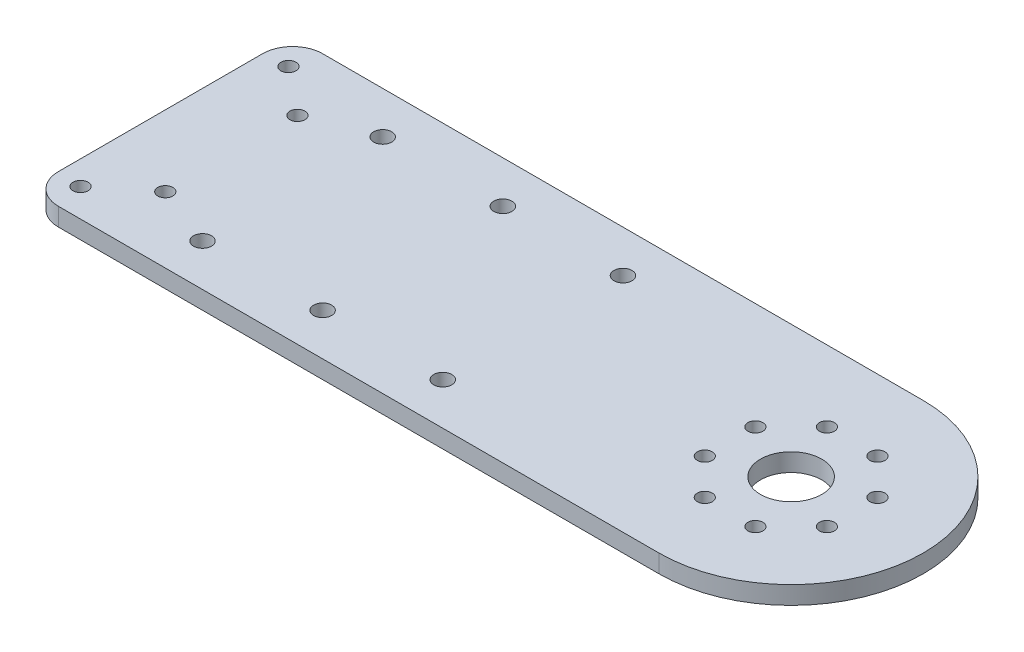
ISO-10303-21;
HEADER;
FILE_DESCRIPTION(('STEP AP214'),'2;1');
FILE_NAME('part.step','',(''),(''),'','','');
FILE_SCHEMA(('AUTOMOTIVE_DESIGN { 1 0 10303 214 1 1 1 1 }'));
ENDSEC;
DATA;
#1=APPLICATION_CONTEXT('core data for automotive mechanical design processes');
#2=APPLICATION_PROTOCOL_DEFINITION('international standard','automotive_design',2000,#1);
#3=PRODUCT_CONTEXT('',#1,'mechanical');
#4=PRODUCT('Part','Part','',(#3));
#5=PRODUCT_RELATED_PRODUCT_CATEGORY('part','',(#4));
#6=PRODUCT_DEFINITION_FORMATION('','',#4);
#7=PRODUCT_DEFINITION_CONTEXT('part definition',#1,'design');
#8=PRODUCT_DEFINITION('design','',#6,#7);
#9=PRODUCT_DEFINITION_SHAPE('','',#8);
#10=(LENGTH_UNIT() NAMED_UNIT(*) SI_UNIT(.MILLI.,.METRE.));
#11=(NAMED_UNIT(*) PLANE_ANGLE_UNIT() SI_UNIT($,.RADIAN.));
#12=(NAMED_UNIT(*) SI_UNIT($,.STERADIAN.) SOLID_ANGLE_UNIT());
#13=UNCERTAINTY_MEASURE_WITH_UNIT(LENGTH_MEASURE(1.E-05),#10,'distance_accuracy_value','');
#14=(GEOMETRIC_REPRESENTATION_CONTEXT(3) GLOBAL_UNCERTAINTY_ASSIGNED_CONTEXT((#13)) GLOBAL_UNIT_ASSIGNED_CONTEXT((#10,
#11,#12)) REPRESENTATION_CONTEXT('',''));
#15=CARTESIAN_POINT('',(0.,0.,0.));
#16=DIRECTION('',(0.,0.,1.));
#17=DIRECTION('',(1.,0.,0.));
#18=AXIS2_PLACEMENT_3D('',#15,#16,#17);
#19=CARTESIAN_POINT('',(128.,3.,0.));
#20=DIRECTION('',(0.,1.,0.));
#21=DIRECTION('',(0.,0.,1.));
#22=AXIS2_PLACEMENT_3D('',#19,#20,#21);
#23=PLANE('',#22);
#24=DIRECTION('',(-1.,0.,0.));
#25=VECTOR('',#24,1.);
#26=CARTESIAN_POINT('',(128.,3.,-22.));
#27=LINE('',#26,#25);
#28=CARTESIAN_POINT('',(128.,3.,-22.));
#29=VERTEX_POINT('',#28);
#30=CARTESIAN_POINT('',(28.,3.,-22.));
#31=VERTEX_POINT('',#30);
#32=EDGE_CURVE('E108',#29,#31,#27,.T.);
#33=ORIENTED_EDGE('',*,*,#32,.T.);
#34=CARTESIAN_POINT('',(28.,3.,-17.));
#35=DIRECTION('',(0.,1.,0.));
#36=DIRECTION('',(0.,0.,1.));
#37=AXIS2_PLACEMENT_3D('',#34,#35,#36);
#38=CIRCLE('',#37,5.);
#39=CARTESIAN_POINT('',(23.,3.,-17.));
#40=VERTEX_POINT('',#39);
#41=EDGE_CURVE('E41',#31,#40,#38,.T.);
#42=ORIENTED_EDGE('',*,*,#41,.T.);
#43=DIRECTION('',(0.,0.,-1.));
#44=VECTOR('',#43,1.);
#45=CARTESIAN_POINT('',(23.,3.,0.));
#46=LINE('',#45,#44);
#47=CARTESIAN_POINT('',(23.,3.,17.));
#48=VERTEX_POINT('',#47);
#49=EDGE_CURVE('E130',#48,#40,#46,.T.);
#50=ORIENTED_EDGE('',*,*,#49,.F.);
#51=CARTESIAN_POINT('',(28.,3.,17.));
#52=DIRECTION('',(0.,1.,0.));
#53=DIRECTION('',(0.,0.,1.));
#54=AXIS2_PLACEMENT_3D('',#51,#52,#53);
#55=CIRCLE('',#54,5.);
#56=CARTESIAN_POINT('',(28.,3.,22.));
#57=VERTEX_POINT('',#56);
#58=EDGE_CURVE('E48',#48,#57,#55,.T.);
#59=ORIENTED_EDGE('',*,*,#58,.T.);
#60=DIRECTION('',(1.,0.,0.));
#61=VECTOR('',#60,1.);
#62=CARTESIAN_POINT('',(0.,3.,22.));
#63=LINE('',#62,#61);
#64=CARTESIAN_POINT('',(128.,3.,22.));
#65=VERTEX_POINT('',#64);
#66=EDGE_CURVE('E86',#57,#65,#63,.T.);
#67=ORIENTED_EDGE('',*,*,#66,.T.);
#68=CARTESIAN_POINT('',(128.,3.,0.));
#69=DIRECTION('',(0.,1.,0.));
#70=DIRECTION('',(0.,0.,1.));
#71=AXIS2_PLACEMENT_3D('',#68,#69,#70);
#72=CIRCLE('',#71,22.);
#73=EDGE_CURVE('E90',#65,#29,#72,.T.);
#74=ORIENTED_EDGE('',*,*,#73,.T.);
#75=EDGE_LOOP('',(#33,#42,#50,#59,#67,#74));
#76=FACE_BOUND('',#75,.T.);
#77=CARTESIAN_POINT('',(45.,3.,15.));
#78=DIRECTION('',(0.,1.,0.));
#79=DIRECTION('',(0.,0.,-1.));
#80=AXIS2_PLACEMENT_3D('',#77,#78,#79);
#81=CIRCLE('',#80,1.5);
#82=CARTESIAN_POINT('',(45.,3.,13.5));
#83=VERTEX_POINT('',#82);
#84=EDGE_CURVE('E138',#83,#83,#81,.T.);
#85=ORIENTED_EDGE('',*,*,#84,.F.);
#86=EDGE_LOOP('',(#85));
#87=FACE_BOUND('',#86,.T.);
#88=CARTESIAN_POINT('',(65.,3.,15.));
#89=DIRECTION('',(0.,1.,0.));
#90=DIRECTION('',(0.,0.,-1.));
#91=AXIS2_PLACEMENT_3D('',#88,#89,#90);
#92=CIRCLE('',#91,1.5);
#93=CARTESIAN_POINT('',(65.,3.,13.5));
#94=VERTEX_POINT('',#93);
#95=EDGE_CURVE('E425',#94,#94,#92,.T.);
#96=ORIENTED_EDGE('',*,*,#95,.F.);
#97=EDGE_LOOP('',(#96));
#98=FACE_BOUND('',#97,.T.);
#99=CARTESIAN_POINT('',(85.,3.,15.));
#100=DIRECTION('',(0.,1.,0.));
#101=DIRECTION('',(0.,0.,-1.));
#102=AXIS2_PLACEMENT_3D('',#99,#100,#101);
#103=CIRCLE('',#102,1.50000000000001);
#104=CARTESIAN_POINT('',(85.,3.,13.5));
#105=VERTEX_POINT('',#104);
#106=EDGE_CURVE('E419',#105,#105,#103,.T.);
#107=ORIENTED_EDGE('',*,*,#106,.F.);
#108=EDGE_LOOP('',(#107));
#109=FACE_BOUND('',#108,.T.);
#110=CARTESIAN_POINT('',(85.,3.,-15.));
#111=DIRECTION('',(0.,1.,0.));
#112=DIRECTION('',(0.,0.,1.));
#113=AXIS2_PLACEMENT_3D('',#110,#111,#112);
#114=CIRCLE('',#113,1.50000000000001);
#115=CARTESIAN_POINT('',(85.,3.,-13.5));
#116=VERTEX_POINT('',#115);
#117=EDGE_CURVE('E413',#116,#116,#114,.T.);
#118=ORIENTED_EDGE('',*,*,#117,.F.);
#119=EDGE_LOOP('',(#118));
#120=FACE_BOUND('',#119,.T.);
#121=CARTESIAN_POINT('',(65.,3.,-15.));
#122=DIRECTION('',(0.,1.,0.));
#123=DIRECTION('',(0.,0.,1.));
#124=AXIS2_PLACEMENT_3D('',#121,#122,#123);
#125=CIRCLE('',#124,1.5);
#126=CARTESIAN_POINT('',(65.,3.,-13.5));
#127=VERTEX_POINT('',#126);
#128=EDGE_CURVE('E407',#127,#127,#125,.T.);
#129=ORIENTED_EDGE('',*,*,#128,.F.);
#130=EDGE_LOOP('',(#129));
#131=FACE_BOUND('',#130,.T.);
#132=CARTESIAN_POINT('',(45.,3.,-15.));
#133=DIRECTION('',(0.,1.,0.));
#134=DIRECTION('',(0.,0.,1.));
#135=AXIS2_PLACEMENT_3D('',#132,#133,#134);
#136=CIRCLE('',#135,1.5);
#137=CARTESIAN_POINT('',(45.,3.,-13.5));
#138=VERTEX_POINT('',#137);
#139=EDGE_CURVE('E406',#138,#138,#136,.T.);
#140=ORIENTED_EDGE('',*,*,#139,.F.);
#141=EDGE_LOOP('',(#140));
#142=FACE_BOUND('',#141,.T.);
#143=CARTESIAN_POINT('',(117.837325142376,3.,4.20951775601606));
#144=DIRECTION('',(0.,1.,0.));
#145=DIRECTION('',(0.,0.,1.));
#146=AXIS2_PLACEMENT_3D('',#143,#144,#145);
#147=CIRCLE('',#146,1.24999999999998);
#148=CARTESIAN_POINT('',(117.837325142376,3.,5.45951775601605));
#149=VERTEX_POINT('',#148);
#150=EDGE_CURVE('E445',#149,#149,#147,.T.);
#151=ORIENTED_EDGE('',*,*,#150,.F.);
#152=EDGE_LOOP('',(#151));
#153=FACE_BOUND('',#152,.T.);
#154=CARTESIAN_POINT('',(34.8,3.,-11.));
#155=DIRECTION('',(0.,1.,0.));
#156=DIRECTION('',(0.,0.,1.));
#157=AXIS2_PLACEMENT_3D('',#154,#155,#156);
#158=CIRCLE('',#157,1.25);
#159=CARTESIAN_POINT('',(34.8,3.,-9.75));
#160=VERTEX_POINT('',#159);
#161=EDGE_CURVE('E463',#160,#160,#158,.T.);
#162=ORIENTED_EDGE('',*,*,#161,.F.);
#163=EDGE_LOOP('',(#162));
#164=FACE_BOUND('',#163,.T.);
#165=CARTESIAN_POINT('',(138.162674857624,3.,4.20951775601592));
#166=DIRECTION('',(0.,1.,0.));
#167=DIRECTION('',(0.,0.,1.));
#168=AXIS2_PLACEMENT_3D('',#165,#166,#167);
#169=CIRCLE('',#168,1.25000000000001);
#170=CARTESIAN_POINT('',(138.162674857624,3.,5.45951775601593));
#171=VERTEX_POINT('',#170);
#172=EDGE_CURVE('E481',#171,#171,#169,.T.);
#173=ORIENTED_EDGE('',*,*,#172,.F.);
#174=EDGE_LOOP('',(#173));
#175=FACE_BOUND('',#174,.T.);
#176=CARTESIAN_POINT('',(132.209517756016,3.,-10.1626748576242));
#177=DIRECTION('',(0.,1.,0.));
#178=DIRECTION('',(0.,0.,1.));
#179=AXIS2_PLACEMENT_3D('',#176,#177,#178);
#180=CIRCLE('',#179,1.25000000000001);
#181=CARTESIAN_POINT('',(132.209517756016,3.,-8.91267485762415));
#182=VERTEX_POINT('',#181);
#183=EDGE_CURVE('E493',#182,#182,#180,.T.);
#184=ORIENTED_EDGE('',*,*,#183,.F.);
#185=EDGE_LOOP('',(#184));
#186=FACE_BOUND('',#185,.T.);
#187=CARTESIAN_POINT('',(117.837325142376,3.,-4.20951775601592));
#188=DIRECTION('',(0.,1.,0.));
#189=DIRECTION('',(0.,0.,1.));
#190=AXIS2_PLACEMENT_3D('',#187,#188,#189);
#191=CIRCLE('',#190,1.24999999999998);
#192=CARTESIAN_POINT('',(117.837325142376,3.,-2.95951775601594));
#193=VERTEX_POINT('',#192);
#194=EDGE_CURVE('E505',#193,#193,#191,.T.);
#195=ORIENTED_EDGE('',*,*,#194,.F.);
#196=EDGE_LOOP('',(#195));
#197=FACE_BOUND('',#196,.T.);
#198=CARTESIAN_POINT('',(128.,3.,0.));
#199=DIRECTION('',(0.,1.,0.));
#200=DIRECTION('',(0.,0.,1.));
#201=AXIS2_PLACEMENT_3D('',#198,#199,#200);
#202=CIRCLE('',#201,5.09999999999998);
#203=CARTESIAN_POINT('',(128.,3.,5.09999999999998));
#204=VERTEX_POINT('',#203);
#205=EDGE_CURVE('E115',#204,#204,#202,.T.);
#206=ORIENTED_EDGE('',*,*,#205,.F.);
#207=EDGE_LOOP('',(#206));
#208=FACE_BOUND('',#207,.T.);
#209=CARTESIAN_POINT('',(123.790482243984,3.,-10.1626748576241));
#210=DIRECTION('',(0.,1.,0.));
#211=DIRECTION('',(0.,0.,1.));
#212=AXIS2_PLACEMENT_3D('',#209,#210,#211);
#213=CIRCLE('',#212,1.25000000000001);
#214=CARTESIAN_POINT('',(123.790482243984,3.,-8.9126748576241));
#215=VERTEX_POINT('',#214);
#216=EDGE_CURVE('E499',#215,#215,#213,.T.);
#217=ORIENTED_EDGE('',*,*,#216,.F.);
#218=EDGE_LOOP('',(#217));
#219=FACE_BOUND('',#218,.T.);
#220=CARTESIAN_POINT('',(138.162674857624,3.,-4.20951775601605));
#221=DIRECTION('',(0.,1.,0.));
#222=DIRECTION('',(0.,0.,1.));
#223=AXIS2_PLACEMENT_3D('',#220,#221,#222);
#224=CIRCLE('',#223,1.25000000000004);
#225=CARTESIAN_POINT('',(138.162674857624,3.,-2.95951775601601));
#226=VERTEX_POINT('',#225);
#227=EDGE_CURVE('E487',#226,#226,#224,.T.);
#228=ORIENTED_EDGE('',*,*,#227,.F.);
#229=EDGE_LOOP('',(#228));
#230=FACE_BOUND('',#229,.T.);
#231=CARTESIAN_POINT('',(132.209517756016,3.,10.1626748576241));
#232=DIRECTION('',(0.,1.,0.));
#233=DIRECTION('',(0.,0.,1.));
#234=AXIS2_PLACEMENT_3D('',#231,#232,#233);
#235=CIRCLE('',#234,1.25000000000001);
#236=CARTESIAN_POINT('',(132.209517756016,3.,11.4126748576241));
#237=VERTEX_POINT('',#236);
#238=EDGE_CURVE('E475',#237,#237,#235,.T.);
#239=ORIENTED_EDGE('',*,*,#238,.F.);
#240=EDGE_LOOP('',(#239));
#241=FACE_BOUND('',#240,.T.);
#242=CARTESIAN_POINT('',(27.,3.,-17.3));
#243=DIRECTION('',(0.,1.,0.));
#244=DIRECTION('',(0.,0.,1.));
#245=AXIS2_PLACEMENT_3D('',#242,#243,#244);
#246=CIRCLE('',#245,1.25);
#247=CARTESIAN_POINT('',(27.,3.,-16.05));
#248=VERTEX_POINT('',#247);
#249=EDGE_CURVE('E469',#248,#248,#246,.T.);
#250=ORIENTED_EDGE('',*,*,#249,.F.);
#251=EDGE_LOOP('',(#250));
#252=FACE_BOUND('',#251,.T.);
#253=CARTESIAN_POINT('',(27.,3.,17.3));
#254=DIRECTION('',(0.,1.,0.));
#255=DIRECTION('',(0.,0.,-1.));
#256=AXIS2_PLACEMENT_3D('',#253,#254,#255);
#257=CIRCLE('',#256,1.25);
#258=CARTESIAN_POINT('',(27.,3.,16.05));
#259=VERTEX_POINT('',#258);
#260=EDGE_CURVE('E457',#259,#259,#257,.T.);
#261=ORIENTED_EDGE('',*,*,#260,.F.);
#262=EDGE_LOOP('',(#261));
#263=FACE_BOUND('',#262,.T.);
#264=CARTESIAN_POINT('',(123.790482243984,3.,10.1626748576242));
#265=DIRECTION('',(0.,1.,0.));
#266=DIRECTION('',(0.,0.,1.));
#267=AXIS2_PLACEMENT_3D('',#264,#265,#266);
#268=CIRCLE('',#267,1.24999999999997);
#269=CARTESIAN_POINT('',(123.790482243984,3.,11.4126748576241));
#270=VERTEX_POINT('',#269);
#271=EDGE_CURVE('E451',#270,#270,#268,.T.);
#272=ORIENTED_EDGE('',*,*,#271,.F.);
#273=EDGE_LOOP('',(#272));
#274=FACE_BOUND('',#273,.T.);
#275=CARTESIAN_POINT('',(34.8,3.,11.));
#276=DIRECTION('',(0.,1.,0.));
#277=DIRECTION('',(0.,0.,-1.));
#278=AXIS2_PLACEMENT_3D('',#275,#276,#277);
#279=CIRCLE('',#278,1.25);
#280=CARTESIAN_POINT('',(34.8,3.,9.75));
#281=VERTEX_POINT('',#280);
#282=EDGE_CURVE('E439',#281,#281,#279,.T.);
#283=ORIENTED_EDGE('',*,*,#282,.F.);
#284=EDGE_LOOP('',(#283));
#285=FACE_BOUND('',#284,.T.);
#286=ADVANCED_FACE('F33',(#76,#87,#98,#109,#120,#131,#142,#153,#164,#175,#186,#197,#208,#219,
#230,#241,#252,#263,#274,#285),#23,.T.);
#287=CARTESIAN_POINT('',(128.,0.,0.));
#288=DIRECTION('',(0.,1.,0.));
#289=DIRECTION('',(0.,0.,1.));
#290=AXIS2_PLACEMENT_3D('',#287,#288,#289);
#291=PLANE('',#290);
#292=CARTESIAN_POINT('',(45.,0.,15.));
#293=DIRECTION('',(0.,1.,0.));
#294=DIRECTION('',(0.,0.,-1.));
#295=AXIS2_PLACEMENT_3D('',#292,#293,#294);
#296=CIRCLE('',#295,1.5);
#297=CARTESIAN_POINT('',(45.,0.,13.5));
#298=VERTEX_POINT('',#297);
#299=EDGE_CURVE('E428',#298,#298,#296,.T.);
#300=ORIENTED_EDGE('',*,*,#299,.T.);
#301=EDGE_LOOP('',(#300));
#302=FACE_BOUND('',#301,.T.);
#303=CARTESIAN_POINT('',(65.,0.,15.));
#304=DIRECTION('',(0.,1.,0.));
#305=DIRECTION('',(0.,0.,-1.));
#306=AXIS2_PLACEMENT_3D('',#303,#304,#305);
#307=CIRCLE('',#306,1.5);
#308=CARTESIAN_POINT('',(65.,0.,13.5));
#309=VERTEX_POINT('',#308);
#310=EDGE_CURVE('E422',#309,#309,#307,.T.);
#311=ORIENTED_EDGE('',*,*,#310,.T.);
#312=EDGE_LOOP('',(#311));
#313=FACE_BOUND('',#312,.T.);
#314=CARTESIAN_POINT('',(85.,0.,15.));
#315=DIRECTION('',(0.,1.,0.));
#316=DIRECTION('',(0.,0.,-1.));
#317=AXIS2_PLACEMENT_3D('',#314,#315,#316);
#318=CIRCLE('',#317,1.50000000000001);
#319=CARTESIAN_POINT('',(85.,0.,13.5));
#320=VERTEX_POINT('',#319);
#321=EDGE_CURVE('E416',#320,#320,#318,.T.);
#322=ORIENTED_EDGE('',*,*,#321,.T.);
#323=EDGE_LOOP('',(#322));
#324=FACE_BOUND('',#323,.T.);
#325=CARTESIAN_POINT('',(85.,0.,-15.));
#326=DIRECTION('',(0.,1.,0.));
#327=DIRECTION('',(0.,0.,1.));
#328=AXIS2_PLACEMENT_3D('',#325,#326,#327);
#329=CIRCLE('',#328,1.50000000000001);
#330=CARTESIAN_POINT('',(85.,0.,-13.5));
#331=VERTEX_POINT('',#330);
#332=EDGE_CURVE('E410',#331,#331,#329,.T.);
#333=ORIENTED_EDGE('',*,*,#332,.T.);
#334=EDGE_LOOP('',(#333));
#335=FACE_BOUND('',#334,.T.);
#336=CARTESIAN_POINT('',(65.,0.,-15.));
#337=DIRECTION('',(0.,1.,0.));
#338=DIRECTION('',(0.,0.,1.));
#339=AXIS2_PLACEMENT_3D('',#336,#337,#338);
#340=CIRCLE('',#339,1.5);
#341=CARTESIAN_POINT('',(65.,0.,-13.5));
#342=VERTEX_POINT('',#341);
#343=EDGE_CURVE('E403',#342,#342,#340,.T.);
#344=ORIENTED_EDGE('',*,*,#343,.T.);
#345=EDGE_LOOP('',(#344));
#346=FACE_BOUND('',#345,.T.);
#347=CARTESIAN_POINT('',(45.,0.,-15.));
#348=DIRECTION('',(0.,1.,0.));
#349=DIRECTION('',(0.,0.,1.));
#350=AXIS2_PLACEMENT_3D('',#347,#348,#349);
#351=CIRCLE('',#350,1.5);
#352=CARTESIAN_POINT('',(45.,0.,-13.5));
#353=VERTEX_POINT('',#352);
#354=EDGE_CURVE('E433',#353,#353,#351,.T.);
#355=ORIENTED_EDGE('',*,*,#354,.T.);
#356=EDGE_LOOP('',(#355));
#357=FACE_BOUND('',#356,.T.);
#358=DIRECTION('',(0.,0.,1.));
#359=VECTOR('',#358,1.);
#360=CARTESIAN_POINT('',(23.,0.,22.));
#361=LINE('',#360,#359);
#362=CARTESIAN_POINT('',(23.,0.,-17.));
#363=VERTEX_POINT('',#362);
#364=CARTESIAN_POINT('',(23.,0.,17.));
#365=VERTEX_POINT('',#364);
#366=EDGE_CURVE('E139',#363,#365,#361,.T.);
#367=ORIENTED_EDGE('',*,*,#366,.F.);
#368=CARTESIAN_POINT('',(28.,0.,-17.));
#369=DIRECTION('',(0.,1.,0.));
#370=DIRECTION('',(0.,0.,1.));
#371=AXIS2_PLACEMENT_3D('',#368,#369,#370);
#372=CIRCLE('',#371,5.);
#373=CARTESIAN_POINT('',(28.,0.,-22.));
#374=VERTEX_POINT('',#373);
#375=EDGE_CURVE('E125',#363,#374,#372,.F.);
#376=ORIENTED_EDGE('',*,*,#375,.T.);
#377=DIRECTION('',(-1.,0.,0.));
#378=VECTOR('',#377,1.);
#379=CARTESIAN_POINT('',(128.,0.,-22.));
#380=LINE('',#379,#378);
#381=CARTESIAN_POINT('',(128.,0.,-22.));
#382=VERTEX_POINT('',#381);
#383=EDGE_CURVE('E94',#382,#374,#380,.T.);
#384=ORIENTED_EDGE('',*,*,#383,.F.);
#385=CARTESIAN_POINT('',(128.,0.,0.));
#386=DIRECTION('',(0.,1.,0.));
#387=DIRECTION('',(0.,0.,1.));
#388=AXIS2_PLACEMENT_3D('',#385,#386,#387);
#389=CIRCLE('',#388,22.);
#390=CARTESIAN_POINT('',(128.,0.,22.));
#391=VERTEX_POINT('',#390);
#392=EDGE_CURVE('E114',#391,#382,#389,.T.);
#393=ORIENTED_EDGE('',*,*,#392,.F.);
#394=DIRECTION('',(1.,0.,0.));
#395=VECTOR('',#394,1.);
#396=CARTESIAN_POINT('',(0.,0.,22.));
#397=LINE('',#396,#395);
#398=CARTESIAN_POINT('',(28.,0.,22.));
#399=VERTEX_POINT('',#398);
#400=EDGE_CURVE('E100',#399,#391,#397,.T.);
#401=ORIENTED_EDGE('',*,*,#400,.F.);
#402=CARTESIAN_POINT('',(28.,0.,17.));
#403=DIRECTION('',(0.,1.,0.));
#404=DIRECTION('',(0.,0.,1.));
#405=AXIS2_PLACEMENT_3D('',#402,#403,#404);
#406=CIRCLE('',#405,5.);
#407=EDGE_CURVE('E123',#399,#365,#406,.F.);
#408=ORIENTED_EDGE('',*,*,#407,.T.);
#409=EDGE_LOOP('',(#367,#376,#384,#393,#401,#408));
#410=FACE_BOUND('',#409,.T.);
#411=CARTESIAN_POINT('',(128.,0.,0.));
#412=DIRECTION('',(0.,1.,0.));
#413=DIRECTION('',(0.,0.,1.));
#414=AXIS2_PLACEMENT_3D('',#411,#412,#413);
#415=CIRCLE('',#414,5.09999999999998);
#416=CARTESIAN_POINT('',(128.,0.,5.09999999999998));
#417=VERTEX_POINT('',#416);
#418=EDGE_CURVE('E508',#417,#417,#415,.T.);
#419=ORIENTED_EDGE('',*,*,#418,.T.);
#420=EDGE_LOOP('',(#419));
#421=FACE_BOUND('',#420,.T.);
#422=CARTESIAN_POINT('',(117.837325142376,0.,-4.20951775601592));
#423=DIRECTION('',(0.,1.,0.));
#424=DIRECTION('',(0.,0.,1.));
#425=AXIS2_PLACEMENT_3D('',#422,#423,#424);
#426=CIRCLE('',#425,1.24999999999998);
#427=CARTESIAN_POINT('',(117.837325142376,0.,-2.95951775601594));
#428=VERTEX_POINT('',#427);
#429=EDGE_CURVE('E502',#428,#428,#426,.T.);
#430=ORIENTED_EDGE('',*,*,#429,.T.);
#431=EDGE_LOOP('',(#430));
#432=FACE_BOUND('',#431,.T.);
#433=CARTESIAN_POINT('',(123.790482243984,0.,-10.1626748576241));
#434=DIRECTION('',(0.,1.,0.));
#435=DIRECTION('',(0.,0.,1.));
#436=AXIS2_PLACEMENT_3D('',#433,#434,#435);
#437=CIRCLE('',#436,1.25000000000001);
#438=CARTESIAN_POINT('',(123.790482243984,0.,-8.9126748576241));
#439=VERTEX_POINT('',#438);
#440=EDGE_CURVE('E496',#439,#439,#437,.T.);
#441=ORIENTED_EDGE('',*,*,#440,.T.);
#442=EDGE_LOOP('',(#441));
#443=FACE_BOUND('',#442,.T.);
#444=CARTESIAN_POINT('',(132.209517756016,0.,-10.1626748576242));
#445=DIRECTION('',(0.,1.,0.));
#446=DIRECTION('',(0.,0.,1.));
#447=AXIS2_PLACEMENT_3D('',#444,#445,#446);
#448=CIRCLE('',#447,1.25000000000001);
#449=CARTESIAN_POINT('',(132.209517756016,0.,-8.91267485762415));
#450=VERTEX_POINT('',#449);
#451=EDGE_CURVE('E490',#450,#450,#448,.T.);
#452=ORIENTED_EDGE('',*,*,#451,.T.);
#453=EDGE_LOOP('',(#452));
#454=FACE_BOUND('',#453,.T.);
#455=CARTESIAN_POINT('',(138.162674857624,0.,-4.20951775601605));
#456=DIRECTION('',(0.,1.,0.));
#457=DIRECTION('',(0.,0.,1.));
#458=AXIS2_PLACEMENT_3D('',#455,#456,#457);
#459=CIRCLE('',#458,1.25000000000004);
#460=CARTESIAN_POINT('',(138.162674857624,0.,-2.95951775601601));
#461=VERTEX_POINT('',#460);
#462=EDGE_CURVE('E484',#461,#461,#459,.T.);
#463=ORIENTED_EDGE('',*,*,#462,.T.);
#464=EDGE_LOOP('',(#463));
#465=FACE_BOUND('',#464,.T.);
#466=CARTESIAN_POINT('',(138.162674857624,0.,4.20951775601592));
#467=DIRECTION('',(0.,1.,0.));
#468=DIRECTION('',(0.,0.,1.));
#469=AXIS2_PLACEMENT_3D('',#466,#467,#468);
#470=CIRCLE('',#469,1.25000000000001);
#471=CARTESIAN_POINT('',(138.162674857624,0.,5.45951775601593));
#472=VERTEX_POINT('',#471);
#473=EDGE_CURVE('E478',#472,#472,#470,.T.);
#474=ORIENTED_EDGE('',*,*,#473,.T.);
#475=EDGE_LOOP('',(#474));
#476=FACE_BOUND('',#475,.T.);
#477=CARTESIAN_POINT('',(132.209517756016,0.,10.1626748576241));
#478=DIRECTION('',(0.,1.,0.));
#479=DIRECTION('',(0.,0.,1.));
#480=AXIS2_PLACEMENT_3D('',#477,#478,#479);
#481=CIRCLE('',#480,1.25000000000001);
#482=CARTESIAN_POINT('',(132.209517756016,0.,11.4126748576241));
#483=VERTEX_POINT('',#482);
#484=EDGE_CURVE('E472',#483,#483,#481,.T.);
#485=ORIENTED_EDGE('',*,*,#484,.T.);
#486=EDGE_LOOP('',(#485));
#487=FACE_BOUND('',#486,.T.);
#488=CARTESIAN_POINT('',(27.,0.,-17.3));
#489=DIRECTION('',(0.,1.,0.));
#490=DIRECTION('',(0.,0.,1.));
#491=AXIS2_PLACEMENT_3D('',#488,#489,#490);
#492=CIRCLE('',#491,1.25);
#493=CARTESIAN_POINT('',(27.,0.,-16.05));
#494=VERTEX_POINT('',#493);
#495=EDGE_CURVE('E466',#494,#494,#492,.T.);
#496=ORIENTED_EDGE('',*,*,#495,.T.);
#497=EDGE_LOOP('',(#496));
#498=FACE_BOUND('',#497,.T.);
#499=CARTESIAN_POINT('',(34.8,0.,-11.));
#500=DIRECTION('',(0.,1.,0.));
#501=DIRECTION('',(0.,0.,1.));
#502=AXIS2_PLACEMENT_3D('',#499,#500,#501);
#503=CIRCLE('',#502,1.25);
#504=CARTESIAN_POINT('',(34.8,0.,-9.75));
#505=VERTEX_POINT('',#504);
#506=EDGE_CURVE('E460',#505,#505,#503,.T.);
#507=ORIENTED_EDGE('',*,*,#506,.T.);
#508=EDGE_LOOP('',(#507));
#509=FACE_BOUND('',#508,.T.);
#510=CARTESIAN_POINT('',(27.,0.,17.3));
#511=DIRECTION('',(0.,1.,0.));
#512=DIRECTION('',(0.,0.,-1.));
#513=AXIS2_PLACEMENT_3D('',#510,#511,#512);
#514=CIRCLE('',#513,1.25);
#515=CARTESIAN_POINT('',(27.,0.,16.05));
#516=VERTEX_POINT('',#515);
#517=EDGE_CURVE('E454',#516,#516,#514,.T.);
#518=ORIENTED_EDGE('',*,*,#517,.T.);
#519=EDGE_LOOP('',(#518));
#520=FACE_BOUND('',#519,.T.);
#521=CARTESIAN_POINT('',(123.790482243984,0.,10.1626748576242));
#522=DIRECTION('',(0.,1.,0.));
#523=DIRECTION('',(0.,0.,1.));
#524=AXIS2_PLACEMENT_3D('',#521,#522,#523);
#525=CIRCLE('',#524,1.24999999999997);
#526=CARTESIAN_POINT('',(123.790482243984,0.,11.4126748576241));
#527=VERTEX_POINT('',#526);
#528=EDGE_CURVE('E448',#527,#527,#525,.T.);
#529=ORIENTED_EDGE('',*,*,#528,.T.);
#530=EDGE_LOOP('',(#529));
#531=FACE_BOUND('',#530,.T.);
#532=CARTESIAN_POINT('',(117.837325142376,0.,4.20951775601606));
#533=DIRECTION('',(0.,1.,0.));
#534=DIRECTION('',(0.,0.,1.));
#535=AXIS2_PLACEMENT_3D('',#532,#533,#534);
#536=CIRCLE('',#535,1.24999999999998);
#537=CARTESIAN_POINT('',(117.837325142376,0.,5.45951775601605));
#538=VERTEX_POINT('',#537);
#539=EDGE_CURVE('E442',#538,#538,#536,.T.);
#540=ORIENTED_EDGE('',*,*,#539,.T.);
#541=EDGE_LOOP('',(#540));
#542=FACE_BOUND('',#541,.T.);
#543=CARTESIAN_POINT('',(34.8,0.,11.));
#544=DIRECTION('',(0.,1.,0.));
#545=DIRECTION('',(0.,0.,-1.));
#546=AXIS2_PLACEMENT_3D('',#543,#544,#545);
#547=CIRCLE('',#546,1.25);
#548=CARTESIAN_POINT('',(34.8,0.,9.75));
#549=VERTEX_POINT('',#548);
#550=EDGE_CURVE('E436',#549,#549,#547,.T.);
#551=ORIENTED_EDGE('',*,*,#550,.T.);
#552=EDGE_LOOP('',(#551));
#553=FACE_BOUND('',#552,.T.);
#554=ADVANCED_FACE('F144',(#302,#313,#324,#335,#346,#357,#410,#421,#432,#443,#454,#465,#476,
#487,#498,#509,#520,#531,#542,#553),#291,.F.);
#555=CARTESIAN_POINT('',(0.,3.,22.));
#556=DIRECTION('',(0.,0.,-1.));
#557=DIRECTION('',(-1.,0.,0.));
#558=AXIS2_PLACEMENT_3D('',#555,#556,#557);
#559=PLANE('',#558);
#560=ORIENTED_EDGE('',*,*,#66,.F.);
#561=DIRECTION('',(0.,-1.,0.));
#562=VECTOR('',#561,1.);
#563=CARTESIAN_POINT('',(28.,3.,22.));
#564=LINE('',#563,#562);
#565=EDGE_CURVE('E11',#57,#399,#564,.T.);
#566=ORIENTED_EDGE('',*,*,#565,.T.);
#567=ORIENTED_EDGE('',*,*,#400,.T.);
#568=DIRECTION('',(0.,-1.,0.));
#569=VECTOR('',#568,1.);
#570=CARTESIAN_POINT('',(128.,3.,22.));
#571=LINE('',#570,#569);
#572=EDGE_CURVE('E97',#65,#391,#571,.T.);
#573=ORIENTED_EDGE('',*,*,#572,.F.);
#574=EDGE_LOOP('',(#560,#566,#567,#573));
#575=FACE_BOUND('',#574,.T.);
#576=ADVANCED_FACE('F98',(#575),#559,.F.);
#577=CARTESIAN_POINT('',(128.,3.,0.));
#578=DIRECTION('',(0.,-1.,0.));
#579=DIRECTION('',(0.,0.,-1.));
#580=AXIS2_PLACEMENT_3D('',#577,#578,#579);
#581=CYLINDRICAL_SURFACE('',#580,22.);
#582=ORIENTED_EDGE('',*,*,#392,.T.);
#583=DIRECTION('',(0.,-1.,0.));
#584=VECTOR('',#583,1.);
#585=CARTESIAN_POINT('',(128.,3.,-22.));
#586=LINE('',#585,#584);
#587=EDGE_CURVE('E104',#29,#382,#586,.T.);
#588=ORIENTED_EDGE('',*,*,#587,.F.);
#589=ORIENTED_EDGE('',*,*,#73,.F.);
#590=ORIENTED_EDGE('',*,*,#572,.T.);
#591=EDGE_LOOP('',(#582,#588,#589,#590));
#592=FACE_BOUND('',#591,.T.);
#593=ADVANCED_FACE('F106',(#592),#581,.T.);
#594=CARTESIAN_POINT('',(128.,3.,-22.));
#595=DIRECTION('',(0.,0.,1.));
#596=DIRECTION('',(1.,0.,0.));
#597=AXIS2_PLACEMENT_3D('',#594,#595,#596);
#598=PLANE('',#597);
#599=ORIENTED_EDGE('',*,*,#383,.T.);
#600=DIRECTION('',(0.,-1.,0.));
#601=VECTOR('',#600,1.);
#602=CARTESIAN_POINT('',(28.,3.,-22.));
#603=LINE('',#602,#601);
#604=EDGE_CURVE('E56',#374,#31,#603,.F.);
#605=ORIENTED_EDGE('',*,*,#604,.T.);
#606=ORIENTED_EDGE('',*,*,#32,.F.);
#607=ORIENTED_EDGE('',*,*,#587,.T.);
#608=EDGE_LOOP('',(#599,#605,#606,#607));
#609=FACE_BOUND('',#608,.T.);
#610=ADVANCED_FACE('F146',(#609),#598,.F.);
#611=CARTESIAN_POINT('',(128.,3.,0.));
#612=DIRECTION('',(0.,-1.,0.));
#613=DIRECTION('',(0.,0.,-1.));
#614=AXIS2_PLACEMENT_3D('',#611,#612,#613);
#615=CYLINDRICAL_SURFACE('',#614,5.09999999999998);
#616=ORIENTED_EDGE('',*,*,#205,.T.);
#617=EDGE_LOOP('',(#616));
#618=FACE_BOUND('',#617,.T.);
#619=ORIENTED_EDGE('',*,*,#418,.F.);
#620=EDGE_LOOP('',(#619));
#621=FACE_BOUND('',#620,.T.);
#622=ADVANCED_FACE('F148',(#618,#621),#615,.F.);
#623=CARTESIAN_POINT('',(117.837325142376,3.,-4.20951775601592));
#624=DIRECTION('',(0.,-1.,0.));
#625=DIRECTION('',(0.,0.,-1.));
#626=AXIS2_PLACEMENT_3D('',#623,#624,#625);
#627=CYLINDRICAL_SURFACE('',#626,1.24999999999998);
#628=ORIENTED_EDGE('',*,*,#194,.T.);
#629=EDGE_LOOP('',(#628));
#630=FACE_BOUND('',#629,.T.);
#631=ORIENTED_EDGE('',*,*,#429,.F.);
#632=EDGE_LOOP('',(#631));
#633=FACE_BOUND('',#632,.T.);
#634=ADVANCED_FACE('F154',(#630,#633),#627,.F.);
#635=CARTESIAN_POINT('',(123.790482243984,3.,-10.1626748576241));
#636=DIRECTION('',(0.,-1.,0.));
#637=DIRECTION('',(0.,0.,-1.));
#638=AXIS2_PLACEMENT_3D('',#635,#636,#637);
#639=CYLINDRICAL_SURFACE('',#638,1.25000000000001);
#640=ORIENTED_EDGE('',*,*,#216,.T.);
#641=EDGE_LOOP('',(#640));
#642=FACE_BOUND('',#641,.T.);
#643=ORIENTED_EDGE('',*,*,#440,.F.);
#644=EDGE_LOOP('',(#643));
#645=FACE_BOUND('',#644,.T.);
#646=ADVANCED_FACE('F168',(#642,#645),#639,.F.);
#647=CARTESIAN_POINT('',(132.209517756016,3.,-10.1626748576242));
#648=DIRECTION('',(0.,-1.,0.));
#649=DIRECTION('',(0.,0.,-1.));
#650=AXIS2_PLACEMENT_3D('',#647,#648,#649);
#651=CYLINDRICAL_SURFACE('',#650,1.25000000000001);
#652=ORIENTED_EDGE('',*,*,#183,.T.);
#653=EDGE_LOOP('',(#652));
#654=FACE_BOUND('',#653,.T.);
#655=ORIENTED_EDGE('',*,*,#451,.F.);
#656=EDGE_LOOP('',(#655));
#657=FACE_BOUND('',#656,.T.);
#658=ADVANCED_FACE('F172',(#654,#657),#651,.F.);
#659=CARTESIAN_POINT('',(138.162674857624,3.,-4.20951775601605));
#660=DIRECTION('',(0.,-1.,0.));
#661=DIRECTION('',(0.,0.,-1.));
#662=AXIS2_PLACEMENT_3D('',#659,#660,#661);
#663=CYLINDRICAL_SURFACE('',#662,1.25000000000004);
#664=ORIENTED_EDGE('',*,*,#227,.T.);
#665=EDGE_LOOP('',(#664));
#666=FACE_BOUND('',#665,.T.);
#667=ORIENTED_EDGE('',*,*,#462,.F.);
#668=EDGE_LOOP('',(#667));
#669=FACE_BOUND('',#668,.T.);
#670=ADVANCED_FACE('F176',(#666,#669),#663,.F.);
#671=CARTESIAN_POINT('',(138.162674857624,3.,4.20951775601592));
#672=DIRECTION('',(0.,-1.,0.));
#673=DIRECTION('',(0.,0.,-1.));
#674=AXIS2_PLACEMENT_3D('',#671,#672,#673);
#675=CYLINDRICAL_SURFACE('',#674,1.25000000000001);
#676=ORIENTED_EDGE('',*,*,#172,.T.);
#677=EDGE_LOOP('',(#676));
#678=FACE_BOUND('',#677,.T.);
#679=ORIENTED_EDGE('',*,*,#473,.F.);
#680=EDGE_LOOP('',(#679));
#681=FACE_BOUND('',#680,.T.);
#682=ADVANCED_FACE('F180',(#678,#681),#675,.F.);
#683=CARTESIAN_POINT('',(132.209517756016,3.,10.1626748576241));
#684=DIRECTION('',(0.,-1.,0.));
#685=DIRECTION('',(0.,0.,-1.));
#686=AXIS2_PLACEMENT_3D('',#683,#684,#685);
#687=CYLINDRICAL_SURFACE('',#686,1.25000000000001);
#688=ORIENTED_EDGE('',*,*,#238,.T.);
#689=EDGE_LOOP('',(#688));
#690=FACE_BOUND('',#689,.T.);
#691=ORIENTED_EDGE('',*,*,#484,.F.);
#692=EDGE_LOOP('',(#691));
#693=FACE_BOUND('',#692,.T.);
#694=ADVANCED_FACE('F184',(#690,#693),#687,.F.);
#695=CARTESIAN_POINT('',(27.,3.,-17.3));
#696=DIRECTION('',(0.,-1.,0.));
#697=DIRECTION('',(0.,0.,-1.));
#698=AXIS2_PLACEMENT_3D('',#695,#696,#697);
#699=CYLINDRICAL_SURFACE('',#698,1.25);
#700=ORIENTED_EDGE('',*,*,#249,.T.);
#701=EDGE_LOOP('',(#700));
#702=FACE_BOUND('',#701,.T.);
#703=ORIENTED_EDGE('',*,*,#495,.F.);
#704=EDGE_LOOP('',(#703));
#705=FACE_BOUND('',#704,.T.);
#706=ADVANCED_FACE('F188',(#702,#705),#699,.F.);
#707=CARTESIAN_POINT('',(34.8,3.,-11.));
#708=DIRECTION('',(0.,-1.,0.));
#709=DIRECTION('',(0.,0.,-1.));
#710=AXIS2_PLACEMENT_3D('',#707,#708,#709);
#711=CYLINDRICAL_SURFACE('',#710,1.25);
#712=ORIENTED_EDGE('',*,*,#161,.T.);
#713=EDGE_LOOP('',(#712));
#714=FACE_BOUND('',#713,.T.);
#715=ORIENTED_EDGE('',*,*,#506,.F.);
#716=EDGE_LOOP('',(#715));
#717=FACE_BOUND('',#716,.T.);
#718=ADVANCED_FACE('F192',(#714,#717),#711,.F.);
#719=CARTESIAN_POINT('',(27.,3.,17.3));
#720=DIRECTION('',(0.,-1.,0.));
#721=DIRECTION('',(0.,0.,-1.));
#722=AXIS2_PLACEMENT_3D('',#719,#720,#721);
#723=CYLINDRICAL_SURFACE('',#722,1.25);
#724=ORIENTED_EDGE('',*,*,#260,.T.);
#725=EDGE_LOOP('',(#724));
#726=FACE_BOUND('',#725,.T.);
#727=ORIENTED_EDGE('',*,*,#517,.F.);
#728=EDGE_LOOP('',(#727));
#729=FACE_BOUND('',#728,.T.);
#730=ADVANCED_FACE('F196',(#726,#729),#723,.F.);
#731=CARTESIAN_POINT('',(123.790482243984,3.,10.1626748576242));
#732=DIRECTION('',(0.,-1.,0.));
#733=DIRECTION('',(0.,0.,-1.));
#734=AXIS2_PLACEMENT_3D('',#731,#732,#733);
#735=CYLINDRICAL_SURFACE('',#734,1.24999999999997);
#736=ORIENTED_EDGE('',*,*,#271,.T.);
#737=EDGE_LOOP('',(#736));
#738=FACE_BOUND('',#737,.T.);
#739=ORIENTED_EDGE('',*,*,#528,.F.);
#740=EDGE_LOOP('',(#739));
#741=FACE_BOUND('',#740,.T.);
#742=ADVANCED_FACE('F200',(#738,#741),#735,.F.);
#743=CARTESIAN_POINT('',(117.837325142376,3.,4.20951775601606));
#744=DIRECTION('',(0.,-1.,0.));
#745=DIRECTION('',(0.,0.,-1.));
#746=AXIS2_PLACEMENT_3D('',#743,#744,#745);
#747=CYLINDRICAL_SURFACE('',#746,1.24999999999998);
#748=ORIENTED_EDGE('',*,*,#150,.T.);
#749=EDGE_LOOP('',(#748));
#750=FACE_BOUND('',#749,.T.);
#751=ORIENTED_EDGE('',*,*,#539,.F.);
#752=EDGE_LOOP('',(#751));
#753=FACE_BOUND('',#752,.T.);
#754=ADVANCED_FACE('F204',(#750,#753),#747,.F.);
#755=CARTESIAN_POINT('',(34.8,3.,11.));
#756=DIRECTION('',(0.,-1.,0.));
#757=DIRECTION('',(0.,0.,-1.));
#758=AXIS2_PLACEMENT_3D('',#755,#756,#757);
#759=CYLINDRICAL_SURFACE('',#758,1.25);
#760=ORIENTED_EDGE('',*,*,#282,.T.);
#761=EDGE_LOOP('',(#760));
#762=FACE_BOUND('',#761,.T.);
#763=ORIENTED_EDGE('',*,*,#550,.F.);
#764=EDGE_LOOP('',(#763));
#765=FACE_BOUND('',#764,.T.);
#766=ADVANCED_FACE('F208',(#762,#765),#759,.F.);
#767=CARTESIAN_POINT('',(45.,0.,-15.));
#768=DIRECTION('',(0.,1.,0.));
#769=DIRECTION('',(0.,0.,1.));
#770=AXIS2_PLACEMENT_3D('',#767,#768,#769);
#771=CYLINDRICAL_SURFACE('',#770,1.5);
#772=ORIENTED_EDGE('',*,*,#354,.F.);
#773=EDGE_LOOP('',(#772));
#774=FACE_BOUND('',#773,.T.);
#775=ORIENTED_EDGE('',*,*,#139,.T.);
#776=EDGE_LOOP('',(#775));
#777=FACE_BOUND('',#776,.T.);
#778=ADVANCED_FACE('F212',(#774,#777),#771,.F.);
#779=CARTESIAN_POINT('',(65.,0.,-15.));
#780=DIRECTION('',(0.,1.,0.));
#781=DIRECTION('',(0.,0.,1.));
#782=AXIS2_PLACEMENT_3D('',#779,#780,#781);
#783=CYLINDRICAL_SURFACE('',#782,1.5);
#784=ORIENTED_EDGE('',*,*,#343,.F.);
#785=EDGE_LOOP('',(#784));
#786=FACE_BOUND('',#785,.T.);
#787=ORIENTED_EDGE('',*,*,#128,.T.);
#788=EDGE_LOOP('',(#787));
#789=FACE_BOUND('',#788,.T.);
#790=ADVANCED_FACE('F216',(#786,#789),#783,.F.);
#791=CARTESIAN_POINT('',(85.,0.,-15.));
#792=DIRECTION('',(0.,1.,0.));
#793=DIRECTION('',(0.,0.,1.));
#794=AXIS2_PLACEMENT_3D('',#791,#792,#793);
#795=CYLINDRICAL_SURFACE('',#794,1.50000000000001);
#796=ORIENTED_EDGE('',*,*,#332,.F.);
#797=EDGE_LOOP('',(#796));
#798=FACE_BOUND('',#797,.T.);
#799=ORIENTED_EDGE('',*,*,#117,.T.);
#800=EDGE_LOOP('',(#799));
#801=FACE_BOUND('',#800,.T.);
#802=ADVANCED_FACE('F229',(#798,#801),#795,.F.);
#803=CARTESIAN_POINT('',(85.,0.,15.));
#804=DIRECTION('',(0.,1.,0.));
#805=DIRECTION('',(0.,0.,1.));
#806=AXIS2_PLACEMENT_3D('',#803,#804,#805);
#807=CYLINDRICAL_SURFACE('',#806,1.50000000000001);
#808=ORIENTED_EDGE('',*,*,#321,.F.);
#809=EDGE_LOOP('',(#808));
#810=FACE_BOUND('',#809,.T.);
#811=ORIENTED_EDGE('',*,*,#106,.T.);
#812=EDGE_LOOP('',(#811));
#813=FACE_BOUND('',#812,.T.);
#814=ADVANCED_FACE('F225',(#810,#813),#807,.F.);
#815=CARTESIAN_POINT('',(65.,0.,15.));
#816=DIRECTION('',(0.,1.,0.));
#817=DIRECTION('',(0.,0.,1.));
#818=AXIS2_PLACEMENT_3D('',#815,#816,#817);
#819=CYLINDRICAL_SURFACE('',#818,1.5);
#820=ORIENTED_EDGE('',*,*,#310,.F.);
#821=EDGE_LOOP('',(#820));
#822=FACE_BOUND('',#821,.T.);
#823=ORIENTED_EDGE('',*,*,#95,.T.);
#824=EDGE_LOOP('',(#823));
#825=FACE_BOUND('',#824,.T.);
#826=ADVANCED_FACE('F221',(#822,#825),#819,.F.);
#827=CARTESIAN_POINT('',(45.,0.,15.));
#828=DIRECTION('',(0.,1.,0.));
#829=DIRECTION('',(0.,0.,1.));
#830=AXIS2_PLACEMENT_3D('',#827,#828,#829);
#831=CYLINDRICAL_SURFACE('',#830,1.5);
#832=ORIENTED_EDGE('',*,*,#299,.F.);
#833=EDGE_LOOP('',(#832));
#834=FACE_BOUND('',#833,.T.);
#835=ORIENTED_EDGE('',*,*,#84,.T.);
#836=EDGE_LOOP('',(#835));
#837=FACE_BOUND('',#836,.T.);
#838=ADVANCED_FACE('F218',(#834,#837),#831,.F.);
#839=CARTESIAN_POINT('',(23.,10.,22.));
#840=DIRECTION('',(1.,0.,0.));
#841=DIRECTION('',(0.,0.,-1.));
#842=AXIS2_PLACEMENT_3D('',#839,#840,#841);
#843=PLANE('',#842);
#844=ORIENTED_EDGE('',*,*,#49,.T.);
#845=DIRECTION('',(0.,-1.,0.));
#846=VECTOR('',#845,1.);
#847=CARTESIAN_POINT('',(23.,10.,-17.));
#848=LINE('',#847,#846);
#849=EDGE_CURVE('E120',#40,#363,#848,.T.);
#850=ORIENTED_EDGE('',*,*,#849,.T.);
#851=ORIENTED_EDGE('',*,*,#366,.T.);
#852=DIRECTION('',(0.,-1.,0.));
#853=VECTOR('',#852,1.);
#854=CARTESIAN_POINT('',(23.,10.,17.));
#855=LINE('',#854,#853);
#856=EDGE_CURVE('E103',#365,#48,#855,.F.);
#857=ORIENTED_EDGE('',*,*,#856,.T.);
#858=EDGE_LOOP('',(#844,#850,#851,#857));
#859=FACE_BOUND('',#858,.T.);
#860=ADVANCED_FACE('F134',(#859),#843,.F.);
#861=CARTESIAN_POINT('',(28.,10.,-17.));
#862=DIRECTION('',(0.,-1.,0.));
#863=DIRECTION('',(0.,0.,-1.));
#864=AXIS2_PLACEMENT_3D('',#861,#862,#863);
#865=CYLINDRICAL_SURFACE('',#864,5.);
#866=ORIENTED_EDGE('',*,*,#41,.F.);
#867=ORIENTED_EDGE('',*,*,#604,.F.);
#868=ORIENTED_EDGE('',*,*,#375,.F.);
#869=ORIENTED_EDGE('',*,*,#849,.F.);
#870=EDGE_LOOP('',(#866,#867,#868,#869));
#871=FACE_BOUND('',#870,.T.);
#872=ADVANCED_FACE('F141',(#871),#865,.T.);
#873=CARTESIAN_POINT('',(28.,3.,17.));
#874=DIRECTION('',(0.,-1.,0.));
#875=DIRECTION('',(0.,0.,-1.));
#876=AXIS2_PLACEMENT_3D('',#873,#874,#875);
#877=CYLINDRICAL_SURFACE('',#876,5.);
#878=ORIENTED_EDGE('',*,*,#58,.F.);
#879=ORIENTED_EDGE('',*,*,#856,.F.);
#880=ORIENTED_EDGE('',*,*,#407,.F.);
#881=ORIENTED_EDGE('',*,*,#565,.F.);
#882=EDGE_LOOP('',(#878,#879,#880,#881));
#883=FACE_BOUND('',#882,.T.);
#884=ADVANCED_FACE('F35',(#883),#877,.T.);
#885=CLOSED_SHELL('',(#286,#554,#576,#593,#610,#622,#634,#646,#658,#670,#682,#694,#706,#718,
#730,#742,#754,#766,#778,#790,#802,#814,#826,#838,#860,#872,#884));
#886=MANIFOLD_SOLID_BREP('B2',#885);
#887=ADVANCED_BREP_SHAPE_REPRESENTATION('',(#18,#886),#14);
#888=SHAPE_DEFINITION_REPRESENTATION(#9,#887);
ENDSEC;
END-ISO-10303-21;
